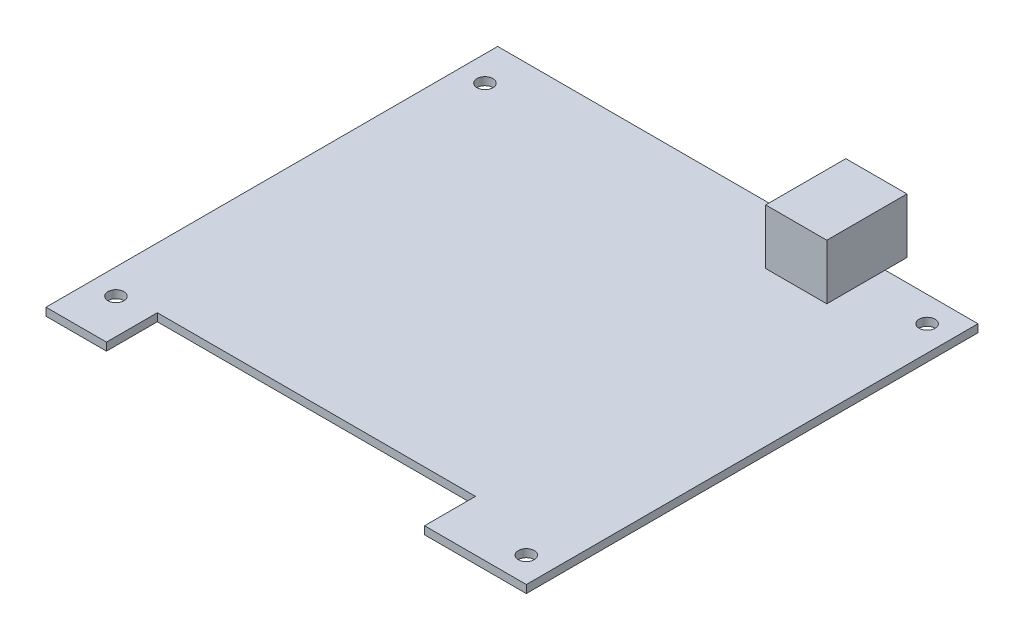
ISO-10303-21;
HEADER;
FILE_DESCRIPTION(('STEP AP214'),'2;1');
FILE_NAME('part.step','',(''),(''),'','','');
FILE_SCHEMA(('AUTOMOTIVE_DESIGN { 1 0 10303 214 1 1 1 1 }'));
ENDSEC;
DATA;
#1=APPLICATION_CONTEXT('core data for automotive mechanical design processes');
#2=APPLICATION_PROTOCOL_DEFINITION('international standard','automotive_design',2000,#1);
#3=PRODUCT_CONTEXT('',#1,'mechanical');
#4=PRODUCT('Part','Part','',(#3));
#5=PRODUCT_RELATED_PRODUCT_CATEGORY('part','',(#4));
#6=PRODUCT_DEFINITION_FORMATION('','',#4);
#7=PRODUCT_DEFINITION_CONTEXT('part definition',#1,'design');
#8=PRODUCT_DEFINITION('design','',#6,#7);
#9=PRODUCT_DEFINITION_SHAPE('','',#8);
#10=(LENGTH_UNIT() NAMED_UNIT(*) SI_UNIT(.MILLI.,.METRE.));
#11=(NAMED_UNIT(*) PLANE_ANGLE_UNIT() SI_UNIT($,.RADIAN.));
#12=(NAMED_UNIT(*) SI_UNIT($,.STERADIAN.) SOLID_ANGLE_UNIT());
#13=UNCERTAINTY_MEASURE_WITH_UNIT(LENGTH_MEASURE(1.E-05),#10,'distance_accuracy_value','');
#14=(GEOMETRIC_REPRESENTATION_CONTEXT(3) GLOBAL_UNCERTAINTY_ASSIGNED_CONTEXT((#13)) GLOBAL_UNIT_ASSIGNED_CONTEXT((#10,
#11,#12)) REPRESENTATION_CONTEXT('',''));
#15=CARTESIAN_POINT('',(0.,0.,0.));
#16=DIRECTION('',(0.,0.,1.));
#17=DIRECTION('',(1.,0.,0.));
#18=AXIS2_PLACEMENT_3D('',#15,#16,#17);
#19=CARTESIAN_POINT('',(17.211,12.57,-49.435));
#20=DIRECTION('',(1.,0.,0.));
#21=DIRECTION('',(0.,0.,-1.));
#22=AXIS2_PLACEMENT_3D('',#19,#20,#21);
#23=PLANE('',#22);
#24=DIRECTION('',(0.,0.,1.));
#25=VECTOR('',#24,1.);
#26=CARTESIAN_POINT('',(17.211,1.57,-49.435));
#27=LINE('',#26,#25);
#28=CARTESIAN_POINT('',(17.211,1.57,-49.435));
#29=VERTEX_POINT('',#28);
#30=CARTESIAN_POINT('',(17.211,1.57,-33.435));
#31=VERTEX_POINT('',#30);
#32=EDGE_CURVE('E105',#29,#31,#27,.T.);
#33=ORIENTED_EDGE('',*,*,#32,.T.);
#34=DIRECTION('',(0.,-1.,0.));
#35=VECTOR('',#34,1.);
#36=CARTESIAN_POINT('',(17.211,12.57,-33.435));
#37=LINE('',#36,#35);
#38=CARTESIAN_POINT('',(17.211,12.57,-33.435));
#39=VERTEX_POINT('',#38);
#40=EDGE_CURVE('E12',#39,#31,#37,.T.);
#41=ORIENTED_EDGE('',*,*,#40,.F.);
#42=DIRECTION('',(0.,0.,1.));
#43=VECTOR('',#42,1.);
#44=CARTESIAN_POINT('',(17.211,12.57,-49.435));
#45=LINE('',#44,#43);
#46=CARTESIAN_POINT('',(17.211,12.57,-49.435));
#47=VERTEX_POINT('',#46);
#48=EDGE_CURVE('E93',#47,#39,#45,.T.);
#49=ORIENTED_EDGE('',*,*,#48,.F.);
#50=DIRECTION('',(0.,-1.,0.));
#51=VECTOR('',#50,1.);
#52=CARTESIAN_POINT('',(17.211,12.57,-49.435));
#53=LINE('',#52,#51);
#54=EDGE_CURVE('E101',#47,#29,#53,.T.);
#55=ORIENTED_EDGE('',*,*,#54,.T.);
#56=EDGE_LOOP('',(#33,#41,#49,#55));
#57=FACE_BOUND('',#56,.T.);
#58=ADVANCED_FACE('F42',(#57),#23,.F.);
#59=CARTESIAN_POINT('',(17.211,12.57,-33.435));
#60=DIRECTION('',(0.,0.,-1.));
#61=DIRECTION('',(-1.,0.,0.));
#62=AXIS2_PLACEMENT_3D('',#59,#60,#61);
#63=PLANE('',#62);
#64=DIRECTION('',(1.,0.,0.));
#65=VECTOR('',#64,1.);
#66=CARTESIAN_POINT('',(17.211,1.57,-33.435));
#67=LINE('',#66,#65);
#68=CARTESIAN_POINT('',(29.411,1.57,-33.435));
#69=VERTEX_POINT('',#68);
#70=EDGE_CURVE('E97',#31,#69,#67,.T.);
#71=ORIENTED_EDGE('',*,*,#70,.T.);
#72=DIRECTION('',(0.,-1.,0.));
#73=VECTOR('',#72,1.);
#74=CARTESIAN_POINT('',(29.411,12.57,-33.435));
#75=LINE('',#74,#73);
#76=CARTESIAN_POINT('',(29.411,12.57,-33.435));
#77=VERTEX_POINT('',#76);
#78=EDGE_CURVE('E50',#77,#69,#75,.T.);
#79=ORIENTED_EDGE('',*,*,#78,.F.);
#80=DIRECTION('',(1.,0.,0.));
#81=VECTOR('',#80,1.);
#82=CARTESIAN_POINT('',(17.211,12.57,-33.435));
#83=LINE('',#82,#81);
#84=EDGE_CURVE('E88',#39,#77,#83,.T.);
#85=ORIENTED_EDGE('',*,*,#84,.F.);
#86=ORIENTED_EDGE('',*,*,#40,.T.);
#87=EDGE_LOOP('',(#71,#79,#85,#86));
#88=FACE_BOUND('',#87,.T.);
#89=ADVANCED_FACE('F96',(#88),#63,.F.);
#90=CARTESIAN_POINT('',(29.411,12.57,-49.435));
#91=DIRECTION('',(-1.,0.,0.));
#92=DIRECTION('',(0.,0.,1.));
#93=AXIS2_PLACEMENT_3D('',#90,#91,#92);
#94=PLANE('',#93);
#95=DIRECTION('',(0.,0.,-1.));
#96=VECTOR('',#95,1.);
#97=CARTESIAN_POINT('',(29.411,1.57,-49.435));
#98=LINE('',#97,#96);
#99=CARTESIAN_POINT('',(29.411,1.57,-49.435));
#100=VERTEX_POINT('',#99);
#101=EDGE_CURVE('E75',#69,#100,#98,.T.);
#102=ORIENTED_EDGE('',*,*,#101,.T.);
#103=DIRECTION('',(0.,-1.,0.));
#104=VECTOR('',#103,1.);
#105=CARTESIAN_POINT('',(29.411,12.57,-49.435));
#106=LINE('',#105,#104);
#107=CARTESIAN_POINT('',(29.411,12.57,-49.435));
#108=VERTEX_POINT('',#107);
#109=EDGE_CURVE('E98',#108,#100,#106,.T.);
#110=ORIENTED_EDGE('',*,*,#109,.F.);
#111=DIRECTION('',(0.,0.,-1.));
#112=VECTOR('',#111,1.);
#113=CARTESIAN_POINT('',(29.411,12.57,-49.435));
#114=LINE('',#113,#112);
#115=EDGE_CURVE('E91',#77,#108,#114,.T.);
#116=ORIENTED_EDGE('',*,*,#115,.F.);
#117=ORIENTED_EDGE('',*,*,#78,.T.);
#118=EDGE_LOOP('',(#102,#110,#116,#117));
#119=FACE_BOUND('',#118,.T.);
#120=ADVANCED_FACE('F99',(#119),#94,.F.);
#121=CARTESIAN_POINT('',(17.211,12.57,-49.435));
#122=DIRECTION('',(0.,0.,1.));
#123=DIRECTION('',(1.,0.,0.));
#124=AXIS2_PLACEMENT_3D('',#121,#122,#123);
#125=PLANE('',#124);
#126=DIRECTION('',(-1.,0.,0.));
#127=VECTOR('',#126,1.);
#128=CARTESIAN_POINT('',(17.211,1.57,-49.435));
#129=LINE('',#128,#127);
#130=EDGE_CURVE('E81',#100,#29,#129,.T.);
#131=ORIENTED_EDGE('',*,*,#130,.T.);
#132=ORIENTED_EDGE('',*,*,#54,.F.);
#133=DIRECTION('',(-1.,0.,0.));
#134=VECTOR('',#133,1.);
#135=CARTESIAN_POINT('',(17.211,12.57,-49.435));
#136=LINE('',#135,#134);
#137=EDGE_CURVE('E58',#108,#47,#136,.T.);
#138=ORIENTED_EDGE('',*,*,#137,.F.);
#139=ORIENTED_EDGE('',*,*,#109,.T.);
#140=EDGE_LOOP('',(#131,#132,#138,#139));
#141=FACE_BOUND('',#140,.T.);
#142=ADVANCED_FACE('F112',(#141),#125,.F.);
#143=CARTESIAN_POINT('',(0.,12.57,0.));
#144=DIRECTION('',(0.,1.,0.));
#145=DIRECTION('',(0.,0.,1.));
#146=AXIS2_PLACEMENT_3D('',#143,#144,#145);
#147=PLANE('',#146);
#148=ORIENTED_EDGE('',*,*,#48,.T.);
#149=ORIENTED_EDGE('',*,*,#84,.T.);
#150=ORIENTED_EDGE('',*,*,#115,.T.);
#151=ORIENTED_EDGE('',*,*,#137,.T.);
#152=EDGE_LOOP('',(#148,#149,#150,#151));
#153=FACE_BOUND('',#152,.T.);
#154=ADVANCED_FACE('F89',(#153),#147,.T.);
#155=CARTESIAN_POINT('',(0.,1.57,0.));
#156=DIRECTION('',(0.,1.,0.));
#157=DIRECTION('',(0.,0.,1.));
#158=AXIS2_PLACEMENT_3D('',#155,#156,#157);
#159=PLANE('',#158);
#160=ORIENTED_EDGE('',*,*,#32,.F.);
#161=ORIENTED_EDGE('',*,*,#130,.F.);
#162=ORIENTED_EDGE('',*,*,#101,.F.);
#163=ORIENTED_EDGE('',*,*,#70,.F.);
#164=EDGE_LOOP('',(#160,#161,#162,#163));
#165=FACE_BOUND('',#164,.T.);
#166=ADVANCED_FACE('F115',(#165),#159,.F.);
#167=CLOSED_SHELL('',(#58,#89,#120,#142,#154,#166));
#168=MANIFOLD_SOLID_BREP('B2',#167);
#169=CARTESIAN_POINT('',(-47.945,1.57,45.085));
#170=DIRECTION('',(1.,0.,0.));
#171=DIRECTION('',(0.,0.,-1.));
#172=AXIS2_PLACEMENT_3D('',#169,#170,#171);
#173=PLANE('',#172);
#174=DIRECTION('',(0.,0.,1.));
#175=VECTOR('',#174,1.);
#176=CARTESIAN_POINT('',(-47.945,0.,45.085));
#177=LINE('',#176,#175);
#178=CARTESIAN_POINT('',(-47.945,0.,-45.085));
#179=VERTEX_POINT('',#178);
#180=CARTESIAN_POINT('',(-47.945,0.,45.085));
#181=VERTEX_POINT('',#180);
#182=EDGE_CURVE('E261',#179,#181,#177,.T.);
#183=ORIENTED_EDGE('',*,*,#182,.T.);
#184=DIRECTION('',(0.,-1.,0.));
#185=VECTOR('',#184,1.);
#186=CARTESIAN_POINT('',(-47.945,1.57,45.085));
#187=LINE('',#186,#185);
#188=CARTESIAN_POINT('',(-47.945,1.57,45.085));
#189=VERTEX_POINT('',#188);
#190=EDGE_CURVE('E40',#189,#181,#187,.T.);
#191=ORIENTED_EDGE('',*,*,#190,.F.);
#192=DIRECTION('',(0.,0.,1.));
#193=VECTOR('',#192,1.);
#194=CARTESIAN_POINT('',(-47.945,1.57,45.085));
#195=LINE('',#194,#193);
#196=CARTESIAN_POINT('',(-47.945,1.57,-45.085));
#197=VERTEX_POINT('',#196);
#198=EDGE_CURVE('E276',#197,#189,#195,.T.);
#199=ORIENTED_EDGE('',*,*,#198,.F.);
#200=DIRECTION('',(0.,-1.,0.));
#201=VECTOR('',#200,1.);
#202=CARTESIAN_POINT('',(-47.945,1.57,-45.085));
#203=LINE('',#202,#201);
#204=EDGE_CURVE('E257',#197,#179,#203,.T.);
#205=ORIENTED_EDGE('',*,*,#204,.T.);
#206=EDGE_LOOP('',(#183,#191,#199,#205));
#207=FACE_BOUND('',#206,.T.);
#208=ADVANCED_FACE('F165',(#207),#173,.F.);
#209=CARTESIAN_POINT('',(-35.875,1.57,45.085));
#210=DIRECTION('',(0.,0.,-1.));
#211=DIRECTION('',(-1.,0.,0.));
#212=AXIS2_PLACEMENT_3D('',#209,#210,#211);
#213=PLANE('',#212);
#214=DIRECTION('',(1.,0.,0.));
#215=VECTOR('',#214,1.);
#216=CARTESIAN_POINT('',(-35.875,0.,45.085));
#217=LINE('',#216,#215);
#218=CARTESIAN_POINT('',(-35.875,0.,45.085));
#219=VERTEX_POINT('',#218);
#220=EDGE_CURVE('E264',#181,#219,#217,.T.);
#221=ORIENTED_EDGE('',*,*,#220,.T.);
#222=DIRECTION('',(0.,-1.,0.));
#223=VECTOR('',#222,1.);
#224=CARTESIAN_POINT('',(-35.875,1.57,45.085));
#225=LINE('',#224,#223);
#226=CARTESIAN_POINT('',(-35.875,1.57,45.085));
#227=VERTEX_POINT('',#226);
#228=EDGE_CURVE('E173',#227,#219,#225,.T.);
#229=ORIENTED_EDGE('',*,*,#228,.F.);
#230=DIRECTION('',(1.,0.,0.));
#231=VECTOR('',#230,1.);
#232=CARTESIAN_POINT('',(-35.875,1.57,45.085));
#233=LINE('',#232,#231);
#234=EDGE_CURVE('E224',#189,#227,#233,.T.);
#235=ORIENTED_EDGE('',*,*,#234,.F.);
#236=ORIENTED_EDGE('',*,*,#190,.T.);
#237=EDGE_LOOP('',(#221,#229,#235,#236));
#238=FACE_BOUND('',#237,.T.);
#239=ADVANCED_FACE('F366',(#238),#213,.F.);
#240=CARTESIAN_POINT('',(-35.875,1.57,45.085));
#241=DIRECTION('',(-1.,0.,0.));
#242=DIRECTION('',(0.,0.,1.));
#243=AXIS2_PLACEMENT_3D('',#240,#241,#242);
#244=PLANE('',#243);
#245=DIRECTION('',(0.,0.,-1.));
#246=VECTOR('',#245,1.);
#247=CARTESIAN_POINT('',(-35.875,0.,45.085));
#248=LINE('',#247,#246);
#249=CARTESIAN_POINT('',(-35.875,0.,34.925));
#250=VERTEX_POINT('',#249);
#251=EDGE_CURVE('E267',#219,#250,#248,.T.);
#252=ORIENTED_EDGE('',*,*,#251,.T.);
#253=DIRECTION('',(0.,-1.,0.));
#254=VECTOR('',#253,1.);
#255=CARTESIAN_POINT('',(-35.875,1.57,34.925));
#256=LINE('',#255,#254);
#257=CARTESIAN_POINT('',(-35.875,1.57,34.925));
#258=VERTEX_POINT('',#257);
#259=EDGE_CURVE('E283',#258,#250,#256,.T.);
#260=ORIENTED_EDGE('',*,*,#259,.F.);
#261=DIRECTION('',(0.,0.,-1.));
#262=VECTOR('',#261,1.);
#263=CARTESIAN_POINT('',(-35.875,1.57,45.085));
#264=LINE('',#263,#262);
#265=EDGE_CURVE('E291',#227,#258,#264,.T.);
#266=ORIENTED_EDGE('',*,*,#265,.F.);
#267=ORIENTED_EDGE('',*,*,#228,.T.);
#268=EDGE_LOOP('',(#252,#260,#266,#267));
#269=FACE_BOUND('',#268,.T.);
#270=ADVANCED_FACE('F289',(#269),#244,.F.);
#271=CARTESIAN_POINT('',(-35.875,1.57,34.925));
#272=DIRECTION('',(0.,0.,-1.));
#273=DIRECTION('',(-1.,0.,0.));
#274=AXIS2_PLACEMENT_3D('',#271,#272,#273);
#275=PLANE('',#274);
#276=DIRECTION('',(1.,0.,0.));
#277=VECTOR('',#276,1.);
#278=CARTESIAN_POINT('',(-35.875,0.,34.925));
#279=LINE('',#278,#277);
#280=CARTESIAN_POINT('',(27.625,0.,34.925));
#281=VERTEX_POINT('',#280);
#282=EDGE_CURVE('E269',#250,#281,#279,.T.);
#283=ORIENTED_EDGE('',*,*,#282,.T.);
#284=DIRECTION('',(0.,-1.,0.));
#285=VECTOR('',#284,1.);
#286=CARTESIAN_POINT('',(27.625,1.57,34.925));
#287=LINE('',#286,#285);
#288=CARTESIAN_POINT('',(27.625,1.57,34.925));
#289=VERTEX_POINT('',#288);
#290=EDGE_CURVE('E280',#289,#281,#287,.T.);
#291=ORIENTED_EDGE('',*,*,#290,.F.);
#292=DIRECTION('',(1.,0.,0.));
#293=VECTOR('',#292,1.);
#294=CARTESIAN_POINT('',(-35.875,1.57,34.925));
#295=LINE('',#294,#293);
#296=EDGE_CURVE('E303',#258,#289,#295,.T.);
#297=ORIENTED_EDGE('',*,*,#296,.F.);
#298=ORIENTED_EDGE('',*,*,#259,.T.);
#299=EDGE_LOOP('',(#283,#291,#297,#298));
#300=FACE_BOUND('',#299,.T.);
#301=ADVANCED_FACE('F299',(#300),#275,.F.);
#302=CARTESIAN_POINT('',(27.625,1.57,45.085));
#303=DIRECTION('',(1.,0.,0.));
#304=DIRECTION('',(0.,0.,-1.));
#305=AXIS2_PLACEMENT_3D('',#302,#303,#304);
#306=PLANE('',#305);
#307=DIRECTION('',(0.,0.,1.));
#308=VECTOR('',#307,1.);
#309=CARTESIAN_POINT('',(27.625,0.,45.085));
#310=LINE('',#309,#308);
#311=CARTESIAN_POINT('',(27.625,0.,45.085));
#312=VERTEX_POINT('',#311);
#313=EDGE_CURVE('E271',#281,#312,#310,.T.);
#314=ORIENTED_EDGE('',*,*,#313,.T.);
#315=DIRECTION('',(0.,-1.,0.));
#316=VECTOR('',#315,1.);
#317=CARTESIAN_POINT('',(27.625,1.57,45.085));
#318=LINE('',#317,#316);
#319=CARTESIAN_POINT('',(27.625,1.57,45.085));
#320=VERTEX_POINT('',#319);
#321=EDGE_CURVE('E252',#320,#312,#318,.T.);
#322=ORIENTED_EDGE('',*,*,#321,.F.);
#323=DIRECTION('',(0.,0.,1.));
#324=VECTOR('',#323,1.);
#325=CARTESIAN_POINT('',(27.625,1.57,45.085));
#326=LINE('',#325,#324);
#327=EDGE_CURVE('E243',#289,#320,#326,.T.);
#328=ORIENTED_EDGE('',*,*,#327,.F.);
#329=ORIENTED_EDGE('',*,*,#290,.T.);
#330=EDGE_LOOP('',(#314,#322,#328,#329));
#331=FACE_BOUND('',#330,.T.);
#332=ADVANCED_FACE('F302',(#331),#306,.F.);
#333=CARTESIAN_POINT('',(47.945,1.57,45.085));
#334=DIRECTION('',(0.,0.,-1.));
#335=DIRECTION('',(-1.,0.,0.));
#336=AXIS2_PLACEMENT_3D('',#333,#334,#335);
#337=PLANE('',#336);
#338=DIRECTION('',(1.,0.,0.));
#339=VECTOR('',#338,1.);
#340=CARTESIAN_POINT('',(47.945,0.,45.085));
#341=LINE('',#340,#339);
#342=CARTESIAN_POINT('',(47.945,0.,45.085));
#343=VERTEX_POINT('',#342);
#344=EDGE_CURVE('E251',#312,#343,#341,.T.);
#345=ORIENTED_EDGE('',*,*,#344,.T.);
#346=DIRECTION('',(0.,-1.,0.));
#347=VECTOR('',#346,1.);
#348=CARTESIAN_POINT('',(47.945,1.57,45.085));
#349=LINE('',#348,#347);
#350=CARTESIAN_POINT('',(47.945,1.57,45.085));
#351=VERTEX_POINT('',#350);
#352=EDGE_CURVE('E248',#351,#343,#349,.T.);
#353=ORIENTED_EDGE('',*,*,#352,.F.);
#354=DIRECTION('',(1.,0.,0.));
#355=VECTOR('',#354,1.);
#356=CARTESIAN_POINT('',(47.945,1.57,45.085));
#357=LINE('',#356,#355);
#358=EDGE_CURVE('E237',#320,#351,#357,.T.);
#359=ORIENTED_EDGE('',*,*,#358,.F.);
#360=ORIENTED_EDGE('',*,*,#321,.T.);
#361=EDGE_LOOP('',(#345,#353,#359,#360));
#362=FACE_BOUND('',#361,.T.);
#363=ADVANCED_FACE('F249',(#362),#337,.F.);
#364=CARTESIAN_POINT('',(47.945,1.57,45.085));
#365=DIRECTION('',(-1.,0.,0.));
#366=DIRECTION('',(0.,0.,1.));
#367=AXIS2_PLACEMENT_3D('',#364,#365,#366);
#368=PLANE('',#367);
#369=DIRECTION('',(0.,0.,-1.));
#370=VECTOR('',#369,1.);
#371=CARTESIAN_POINT('',(47.945,0.,45.085));
#372=LINE('',#371,#370);
#373=CARTESIAN_POINT('',(47.945,0.,-45.085));
#374=VERTEX_POINT('',#373);
#375=EDGE_CURVE('E210',#343,#374,#372,.T.);
#376=ORIENTED_EDGE('',*,*,#375,.T.);
#377=DIRECTION('',(0.,-1.,0.));
#378=VECTOR('',#377,1.);
#379=CARTESIAN_POINT('',(47.945,1.57,-45.085));
#380=LINE('',#379,#378);
#381=CARTESIAN_POINT('',(47.945,1.57,-45.085));
#382=VERTEX_POINT('',#381);
#383=EDGE_CURVE('E253',#382,#374,#380,.T.);
#384=ORIENTED_EDGE('',*,*,#383,.F.);
#385=DIRECTION('',(0.,0.,-1.));
#386=VECTOR('',#385,1.);
#387=CARTESIAN_POINT('',(47.945,1.57,45.085));
#388=LINE('',#387,#386);
#389=EDGE_CURVE('E241',#351,#382,#388,.T.);
#390=ORIENTED_EDGE('',*,*,#389,.F.);
#391=ORIENTED_EDGE('',*,*,#352,.T.);
#392=EDGE_LOOP('',(#376,#384,#390,#391));
#393=FACE_BOUND('',#392,.T.);
#394=ADVANCED_FACE('F255',(#393),#368,.F.);
#395=CARTESIAN_POINT('',(47.945,1.57,-45.085));
#396=DIRECTION('',(0.,0.,1.));
#397=DIRECTION('',(1.,0.,0.));
#398=AXIS2_PLACEMENT_3D('',#395,#396,#397);
#399=PLANE('',#398);
#400=DIRECTION('',(-1.,0.,0.));
#401=VECTOR('',#400,1.);
#402=CARTESIAN_POINT('',(47.945,0.,-45.085));
#403=LINE('',#402,#401);
#404=EDGE_CURVE('E216',#374,#179,#403,.T.);
#405=ORIENTED_EDGE('',*,*,#404,.T.);
#406=ORIENTED_EDGE('',*,*,#204,.F.);
#407=DIRECTION('',(-1.,0.,0.));
#408=VECTOR('',#407,1.);
#409=CARTESIAN_POINT('',(47.945,1.57,-45.085));
#410=LINE('',#409,#408);
#411=EDGE_CURVE('E181',#382,#197,#410,.T.);
#412=ORIENTED_EDGE('',*,*,#411,.F.);
#413=ORIENTED_EDGE('',*,*,#383,.T.);
#414=EDGE_LOOP('',(#405,#406,#412,#413));
#415=FACE_BOUND('',#414,.T.);
#416=ADVANCED_FACE('F344',(#415),#399,.F.);
#417=CARTESIAN_POINT('',(0.,1.57,0.));
#418=DIRECTION('',(0.,1.,0.));
#419=DIRECTION('',(0.,0.,1.));
#420=AXIS2_PLACEMENT_3D('',#417,#418,#419);
#421=PLANE('',#420);
#422=CARTESIAN_POINT('',(42.865,1.57,-40.005));
#423=DIRECTION('',(0.,1.,0.));
#424=DIRECTION('',(0.,0.,1.));
#425=AXIS2_PLACEMENT_3D('',#422,#423,#424);
#426=CIRCLE('',#425,1.59);
#427=CARTESIAN_POINT('',(42.865,1.57,-38.415));
#428=VERTEX_POINT('',#427);
#429=EDGE_CURVE('E327',#428,#428,#426,.T.);
#430=ORIENTED_EDGE('',*,*,#429,.F.);
#431=EDGE_LOOP('',(#430));
#432=FACE_BOUND('',#431,.T.);
#433=CARTESIAN_POINT('',(-42.865,1.57,-37.465));
#434=DIRECTION('',(0.,1.,0.));
#435=DIRECTION('',(0.,0.,1.));
#436=AXIS2_PLACEMENT_3D('',#433,#434,#435);
#437=CIRCLE('',#436,1.59);
#438=CARTESIAN_POINT('',(-42.865,1.57,-35.875));
#439=VERTEX_POINT('',#438);
#440=EDGE_CURVE('E321',#439,#439,#437,.T.);
#441=ORIENTED_EDGE('',*,*,#440,.F.);
#442=EDGE_LOOP('',(#441));
#443=FACE_BOUND('',#442,.T.);
#444=CARTESIAN_POINT('',(-42.865,1.57,36.195));
#445=DIRECTION('',(0.,1.,0.));
#446=DIRECTION('',(0.,0.,1.));
#447=AXIS2_PLACEMENT_3D('',#444,#445,#446);
#448=CIRCLE('',#447,1.59);
#449=CARTESIAN_POINT('',(-42.865,1.57,37.785));
#450=VERTEX_POINT('',#449);
#451=EDGE_CURVE('E315',#450,#450,#448,.T.);
#452=ORIENTED_EDGE('',*,*,#451,.F.);
#453=EDGE_LOOP('',(#452));
#454=FACE_BOUND('',#453,.T.);
#455=CARTESIAN_POINT('',(42.865,1.57,40.005));
#456=DIRECTION('',(0.,1.,0.));
#457=DIRECTION('',(0.,0.,1.));
#458=AXIS2_PLACEMENT_3D('',#455,#456,#457);
#459=CIRCLE('',#458,1.59);
#460=CARTESIAN_POINT('',(42.865,1.57,41.595));
#461=VERTEX_POINT('',#460);
#462=EDGE_CURVE('E309',#461,#461,#459,.T.);
#463=ORIENTED_EDGE('',*,*,#462,.F.);
#464=EDGE_LOOP('',(#463));
#465=FACE_BOUND('',#464,.T.);
#466=ORIENTED_EDGE('',*,*,#198,.T.);
#467=ORIENTED_EDGE('',*,*,#234,.T.);
#468=ORIENTED_EDGE('',*,*,#265,.T.);
#469=ORIENTED_EDGE('',*,*,#296,.T.);
#470=ORIENTED_EDGE('',*,*,#327,.T.);
#471=ORIENTED_EDGE('',*,*,#358,.T.);
#472=ORIENTED_EDGE('',*,*,#389,.T.);
#473=ORIENTED_EDGE('',*,*,#411,.T.);
#474=EDGE_LOOP('',(#466,#467,#468,#469,#470,#471,#472,#473));
#475=FACE_BOUND('',#474,.T.);
#476=ADVANCED_FACE('F239',(#432,#443,#454,#465,#475),#421,.T.);
#477=CARTESIAN_POINT('',(0.,0.,0.));
#478=DIRECTION('',(0.,1.,0.));
#479=DIRECTION('',(0.,0.,1.));
#480=AXIS2_PLACEMENT_3D('',#477,#478,#479);
#481=PLANE('',#480);
#482=CARTESIAN_POINT('',(42.865,0.,-40.005));
#483=DIRECTION('',(0.,1.,0.));
#484=DIRECTION('',(0.,0.,1.));
#485=AXIS2_PLACEMENT_3D('',#482,#483,#484);
#486=CIRCLE('',#485,1.59);
#487=CARTESIAN_POINT('',(42.865,0.,-38.415));
#488=VERTEX_POINT('',#487);
#489=EDGE_CURVE('E324',#488,#488,#486,.T.);
#490=ORIENTED_EDGE('',*,*,#489,.T.);
#491=EDGE_LOOP('',(#490));
#492=FACE_BOUND('',#491,.T.);
#493=CARTESIAN_POINT('',(-42.865,0.,-37.465));
#494=DIRECTION('',(0.,1.,0.));
#495=DIRECTION('',(0.,0.,1.));
#496=AXIS2_PLACEMENT_3D('',#493,#494,#495);
#497=CIRCLE('',#496,1.59);
#498=CARTESIAN_POINT('',(-42.865,0.,-35.875));
#499=VERTEX_POINT('',#498);
#500=EDGE_CURVE('E318',#499,#499,#497,.T.);
#501=ORIENTED_EDGE('',*,*,#500,.T.);
#502=EDGE_LOOP('',(#501));
#503=FACE_BOUND('',#502,.T.);
#504=CARTESIAN_POINT('',(-42.865,0.,36.195));
#505=DIRECTION('',(0.,1.,0.));
#506=DIRECTION('',(0.,0.,1.));
#507=AXIS2_PLACEMENT_3D('',#504,#505,#506);
#508=CIRCLE('',#507,1.59);
#509=CARTESIAN_POINT('',(-42.865,0.,37.785));
#510=VERTEX_POINT('',#509);
#511=EDGE_CURVE('E312',#510,#510,#508,.T.);
#512=ORIENTED_EDGE('',*,*,#511,.T.);
#513=EDGE_LOOP('',(#512));
#514=FACE_BOUND('',#513,.T.);
#515=CARTESIAN_POINT('',(42.865,0.,40.005));
#516=DIRECTION('',(0.,1.,0.));
#517=DIRECTION('',(0.,0.,1.));
#518=AXIS2_PLACEMENT_3D('',#515,#516,#517);
#519=CIRCLE('',#518,1.59);
#520=CARTESIAN_POINT('',(42.865,0.,41.595));
#521=VERTEX_POINT('',#520);
#522=EDGE_CURVE('E265',#521,#521,#519,.T.);
#523=ORIENTED_EDGE('',*,*,#522,.T.);
#524=EDGE_LOOP('',(#523));
#525=FACE_BOUND('',#524,.T.);
#526=ORIENTED_EDGE('',*,*,#182,.F.);
#527=ORIENTED_EDGE('',*,*,#404,.F.);
#528=ORIENTED_EDGE('',*,*,#375,.F.);
#529=ORIENTED_EDGE('',*,*,#344,.F.);
#530=ORIENTED_EDGE('',*,*,#313,.F.);
#531=ORIENTED_EDGE('',*,*,#282,.F.);
#532=ORIENTED_EDGE('',*,*,#251,.F.);
#533=ORIENTED_EDGE('',*,*,#220,.F.);
#534=EDGE_LOOP('',(#526,#527,#528,#529,#530,#531,#532,#533));
#535=FACE_BOUND('',#534,.T.);
#536=ADVANCED_FACE('F295',(#492,#503,#514,#525,#535),#481,.F.);
#537=CARTESIAN_POINT('',(42.865,0.,40.005));
#538=DIRECTION('',(0.,1.,0.));
#539=DIRECTION('',(0.,0.,1.));
#540=AXIS2_PLACEMENT_3D('',#537,#538,#539);
#541=CYLINDRICAL_SURFACE('',#540,1.59);
#542=ORIENTED_EDGE('',*,*,#522,.F.);
#543=EDGE_LOOP('',(#542));
#544=FACE_BOUND('',#543,.T.);
#545=ORIENTED_EDGE('',*,*,#462,.T.);
#546=EDGE_LOOP('',(#545));
#547=FACE_BOUND('',#546,.T.);
#548=ADVANCED_FACE('F352',(#544,#547),#541,.F.);
#549=CARTESIAN_POINT('',(-42.865,0.,36.195));
#550=DIRECTION('',(0.,1.,0.));
#551=DIRECTION('',(0.,0.,1.));
#552=AXIS2_PLACEMENT_3D('',#549,#550,#551);
#553=CYLINDRICAL_SURFACE('',#552,1.59);
#554=ORIENTED_EDGE('',*,*,#511,.F.);
#555=EDGE_LOOP('',(#554));
#556=FACE_BOUND('',#555,.T.);
#557=ORIENTED_EDGE('',*,*,#451,.T.);
#558=EDGE_LOOP('',(#557));
#559=FACE_BOUND('',#558,.T.);
#560=ADVANCED_FACE('F354',(#556,#559),#553,.F.);
#561=CARTESIAN_POINT('',(-42.865,0.,-37.465));
#562=DIRECTION('',(0.,1.,0.));
#563=DIRECTION('',(0.,0.,1.));
#564=AXIS2_PLACEMENT_3D('',#561,#562,#563);
#565=CYLINDRICAL_SURFACE('',#564,1.59);
#566=ORIENTED_EDGE('',*,*,#500,.F.);
#567=EDGE_LOOP('',(#566));
#568=FACE_BOUND('',#567,.T.);
#569=ORIENTED_EDGE('',*,*,#440,.T.);
#570=EDGE_LOOP('',(#569));
#571=FACE_BOUND('',#570,.T.);
#572=ADVANCED_FACE('F338',(#568,#571),#565,.F.);
#573=CARTESIAN_POINT('',(42.865,0.,-40.005));
#574=DIRECTION('',(0.,1.,0.));
#575=DIRECTION('',(0.,0.,1.));
#576=AXIS2_PLACEMENT_3D('',#573,#574,#575);
#577=CYLINDRICAL_SURFACE('',#576,1.59);
#578=ORIENTED_EDGE('',*,*,#489,.F.);
#579=EDGE_LOOP('',(#578));
#580=FACE_BOUND('',#579,.T.);
#581=ORIENTED_EDGE('',*,*,#429,.T.);
#582=EDGE_LOOP('',(#581));
#583=FACE_BOUND('',#582,.T.);
#584=ADVANCED_FACE('F335',(#580,#583),#577,.F.);
#585=CLOSED_SHELL('',(#208,#239,#270,#301,#332,#363,#394,#416,#476,#536,#548,#560,#572,#584));
#586=MANIFOLD_SOLID_BREP('B6',#585);
#587=ADVANCED_BREP_SHAPE_REPRESENTATION('',(#18,#168,#586),#14);
#588=SHAPE_DEFINITION_REPRESENTATION(#9,#587);
ENDSEC;
END-ISO-10303-21;
